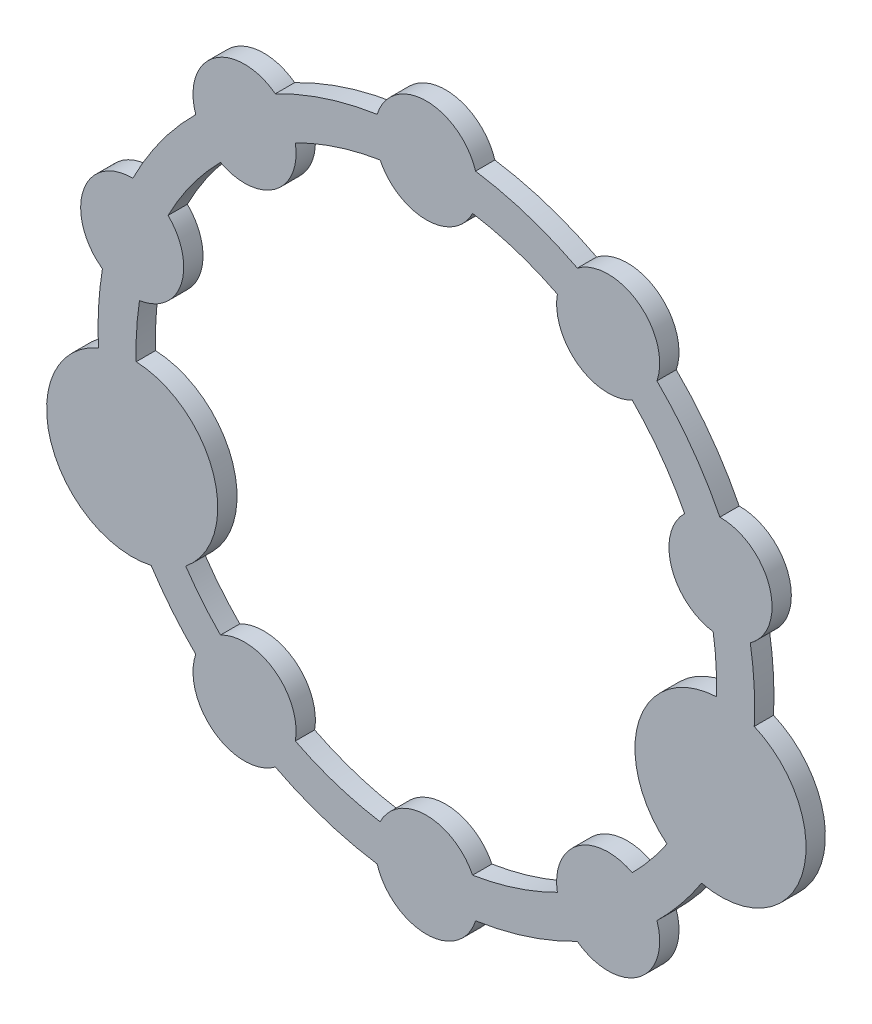
ISO-10303-21;
HEADER;
FILE_DESCRIPTION(('STEP AP214'),'2;1');
FILE_NAME('part.step','',(''),(''),'','','');
FILE_SCHEMA(('AUTOMOTIVE_DESIGN { 1 0 10303 214 1 1 1 1 }'));
ENDSEC;
DATA;
#1=APPLICATION_CONTEXT('core data for automotive mechanical design processes');
#2=APPLICATION_PROTOCOL_DEFINITION('international standard','automotive_design',2000,#1);
#3=PRODUCT_CONTEXT('',#1,'mechanical');
#4=PRODUCT('Part','Part','',(#3));
#5=PRODUCT_RELATED_PRODUCT_CATEGORY('part','',(#4));
#6=PRODUCT_DEFINITION_FORMATION('','',#4);
#7=PRODUCT_DEFINITION_CONTEXT('part definition',#1,'design');
#8=PRODUCT_DEFINITION('design','',#6,#7);
#9=PRODUCT_DEFINITION_SHAPE('','',#8);
#10=(LENGTH_UNIT() NAMED_UNIT(*) SI_UNIT(.MILLI.,.METRE.));
#11=(NAMED_UNIT(*) PLANE_ANGLE_UNIT() SI_UNIT($,.RADIAN.));
#12=(NAMED_UNIT(*) SI_UNIT($,.STERADIAN.) SOLID_ANGLE_UNIT());
#13=UNCERTAINTY_MEASURE_WITH_UNIT(LENGTH_MEASURE(1.E-05),#10,'distance_accuracy_value','');
#14=(GEOMETRIC_REPRESENTATION_CONTEXT(3) GLOBAL_UNCERTAINTY_ASSIGNED_CONTEXT((#13)) GLOBAL_UNIT_ASSIGNED_CONTEXT((#10,
#11,#12)) REPRESENTATION_CONTEXT('',''));
#15=CARTESIAN_POINT('',(0.,0.,0.));
#16=DIRECTION('',(0.,0.,1.));
#17=DIRECTION('',(1.,0.,0.));
#18=AXIS2_PLACEMENT_3D('',#15,#16,#17);
#19=CARTESIAN_POINT('',(0.,0.,0.));
#20=DIRECTION('',(0.,0.,1.));
#21=DIRECTION('',(1.,0.,0.));
#22=AXIS2_PLACEMENT_3D('',#19,#20,#21);
#23=CYLINDRICAL_SURFACE('',#22,34.53);
#24=CARTESIAN_POINT('',(0.,0.,0.));
#25=DIRECTION('',(0.,0.,1.));
#26=DIRECTION('',(1.,0.,0.));
#27=AXIS2_PLACEMENT_3D('',#24,#25,#26);
#28=CIRCLE('',#27,34.53);
#29=CARTESIAN_POINT('',(24.2539232103898,-24.5777970718394,0.));
#30=VERTEX_POINT('',#29);
#31=CARTESIAN_POINT('',(28.94469956259,-18.8288413672059,0.));
#32=VERTEX_POINT('',#31);
#33=EDGE_CURVE('E559',#30,#32,#28,.T.);
#34=ORIENTED_EDGE('',*,*,#33,.T.);
#35=DIRECTION('',(0.,0.,1.));
#36=VECTOR('',#35,1.);
#37=CARTESIAN_POINT('',(28.94469956259,-18.8288413672059,1.015));
#38=LINE('',#37,#36);
#39=CARTESIAN_POINT('',(28.94469956259,-18.8288413672059,2.03));
#40=VERTEX_POINT('',#39);
#41=EDGE_CURVE('E544',#32,#40,#38,.T.);
#42=ORIENTED_EDGE('',*,*,#41,.T.);
#43=CARTESIAN_POINT('',(0.,0.,2.03));
#44=DIRECTION('',(0.,0.,1.));
#45=DIRECTION('',(1.,0.,0.));
#46=AXIS2_PLACEMENT_3D('',#43,#44,#45);
#47=CIRCLE('',#46,34.53);
#48=CARTESIAN_POINT('',(24.2539232103897,-24.5777970718394,2.03));
#49=VERTEX_POINT('',#48);
#50=EDGE_CURVE('E53',#49,#40,#47,.T.);
#51=ORIENTED_EDGE('',*,*,#50,.F.);
#52=DIRECTION('',(0.,0.,-1.));
#53=VECTOR('',#52,1.);
#54=CARTESIAN_POINT('',(24.2539232103898,-24.5777970718394,1.015));
#55=LINE('',#54,#53);
#56=EDGE_CURVE('E511',#49,#30,#55,.T.);
#57=ORIENTED_EDGE('',*,*,#56,.T.);
#58=EDGE_LOOP('',(#34,#42,#51,#57));
#59=FACE_BOUND('',#58,.T.);
#60=ADVANCED_FACE('F38',(#59),#23,.T.);
#61=CARTESIAN_POINT('',(0.,0.,0.));
#62=DIRECTION('',(0.,0.,1.));
#63=DIRECTION('',(1.,0.,0.));
#64=AXIS2_PLACEMENT_3D('',#61,#62,#63);
#65=CYLINDRICAL_SURFACE('',#64,30.53);
#66=DIRECTION('',(0.,0.,1.));
#67=VECTOR('',#66,1.);
#68=CARTESIAN_POINT('',(25.3088081019418,-17.0746927485998,1.015));
#69=LINE('',#68,#67);
#70=CARTESIAN_POINT('',(25.3088081019418,-17.0746927485998,0.));
#71=VERTEX_POINT('',#70);
#72=CARTESIAN_POINT('',(25.3088081019418,-17.0746927485998,2.03));
#73=VERTEX_POINT('',#72);
#74=EDGE_CURVE('E303',#71,#73,#69,.T.);
#75=ORIENTED_EDGE('',*,*,#74,.F.);
#76=CARTESIAN_POINT('',(0.,0.,0.));
#77=DIRECTION('',(0.,0.,1.));
#78=DIRECTION('',(1.,0.,0.));
#79=AXIS2_PLACEMENT_3D('',#76,#77,#78);
#80=CIRCLE('',#79,30.53);
#81=CARTESIAN_POINT('',(21.6513433857745,-21.524410086952,0.));
#82=VERTEX_POINT('',#81);
#83=EDGE_CURVE('E455',#82,#71,#80,.T.);
#84=ORIENTED_EDGE('',*,*,#83,.F.);
#85=DIRECTION('',(0.,0.,-1.));
#86=VECTOR('',#85,1.);
#87=CARTESIAN_POINT('',(21.6513433857745,-21.524410086952,1.015));
#88=LINE('',#87,#86);
#89=CARTESIAN_POINT('',(21.6513433857745,-21.524410086952,2.03));
#90=VERTEX_POINT('',#89);
#91=EDGE_CURVE('E517',#90,#82,#88,.T.);
#92=ORIENTED_EDGE('',*,*,#91,.F.);
#93=CARTESIAN_POINT('',(0.,0.,2.03));
#94=DIRECTION('',(0.,0.,1.));
#95=DIRECTION('',(1.,0.,0.));
#96=AXIS2_PLACEMENT_3D('',#93,#94,#95);
#97=CIRCLE('',#96,30.53);
#98=EDGE_CURVE('E324',#90,#73,#97,.T.);
#99=ORIENTED_EDGE('',*,*,#98,.T.);
#100=EDGE_LOOP('',(#75,#84,#92,#99));
#101=FACE_BOUND('',#100,.T.);
#102=ADVANCED_FACE('F661',(#101),#65,.F.);
#103=CARTESIAN_POINT('',(34.4840691166105,-1.78041488446724,2.03));
#104=VERTEX_POINT('',#103);
#105=CARTESIAN_POINT('',(34.0683027101346,5.62775714211573,2.03));
#106=VERTEX_POINT('',#105);
#107=EDGE_CURVE('E561',#104,#106,#47,.T.);
#108=ORIENTED_EDGE('',*,*,#107,.F.);
#109=DIRECTION('',(0.,0.,1.));
#110=VECTOR('',#109,1.);
#111=CARTESIAN_POINT('',(34.4840691166105,-1.78041488446724,1.015));
#112=LINE('',#111,#110);
#113=CARTESIAN_POINT('',(34.4840691166105,-1.78041488446724,0.));
#114=VERTEX_POINT('',#113);
#115=EDGE_CURVE('E317',#104,#114,#112,.F.);
#116=ORIENTED_EDGE('',*,*,#115,.T.);
#117=CARTESIAN_POINT('',(34.0683027101346,5.62775714211573,0.));
#118=VERTEX_POINT('',#117);
#119=EDGE_CURVE('E622',#114,#118,#28,.T.);
#120=ORIENTED_EDGE('',*,*,#119,.T.);
#121=DIRECTION('',(0.,0.,-1.));
#122=VECTOR('',#121,1.);
#123=CARTESIAN_POINT('',(34.0683027101346,5.62775714211572,1.015));
#124=LINE('',#123,#122);
#125=EDGE_CURVE('E499',#118,#106,#124,.F.);
#126=ORIENTED_EDGE('',*,*,#125,.T.);
#127=EDGE_LOOP('',(#108,#116,#120,#126));
#128=FACE_BOUND('',#127,.T.);
#129=ADVANCED_FACE('F664',(#128),#23,.T.);
#130=DIRECTION('',(0.,0.,1.));
#131=VECTOR('',#130,1.);
#132=CARTESIAN_POINT('',(30.5115084468974,-1.06242754807374,1.015));
#133=LINE('',#132,#131);
#134=CARTESIAN_POINT('',(30.5115084468974,-1.06242754807374,2.03));
#135=VERTEX_POINT('',#134);
#136=CARTESIAN_POINT('',(30.5115084468974,-1.06242754807374,0.));
#137=VERTEX_POINT('',#136);
#138=EDGE_CURVE('E300',#135,#137,#133,.F.);
#139=ORIENTED_EDGE('',*,*,#138,.F.);
#140=CARTESIAN_POINT('',(30.1680355635449,4.68727321976128,2.03));
#141=VERTEX_POINT('',#140);
#142=EDGE_CURVE('E314',#135,#141,#97,.T.);
#143=ORIENTED_EDGE('',*,*,#142,.T.);
#144=DIRECTION('',(0.,0.,-1.));
#145=VECTOR('',#144,1.);
#146=CARTESIAN_POINT('',(30.1680355635449,4.68727321976128,1.015));
#147=LINE('',#146,#145);
#148=CARTESIAN_POINT('',(30.1680355635449,4.68727321976128,0.));
#149=VERTEX_POINT('',#148);
#150=EDGE_CURVE('E505',#149,#141,#147,.F.);
#151=ORIENTED_EDGE('',*,*,#150,.F.);
#152=EDGE_CURVE('E316',#137,#149,#80,.T.);
#153=ORIENTED_EDGE('',*,*,#152,.F.);
#154=EDGE_LOOP('',(#139,#143,#151,#153));
#155=FACE_BOUND('',#154,.T.);
#156=ADVANCED_FACE('F312',(#155),#65,.F.);
#157=CARTESIAN_POINT('',(5.17536940480595,-34.1399538887181,0.));
#158=VERTEX_POINT('',#157);
#159=CARTESIAN_POINT('',(15.8799996090774,-30.6618086944606,0.));
#160=VERTEX_POINT('',#159);
#161=EDGE_CURVE('E623',#158,#160,#28,.T.);
#162=ORIENTED_EDGE('',*,*,#161,.T.);
#163=DIRECTION('',(0.,0.,-1.));
#164=VECTOR('',#163,1.);
#165=CARTESIAN_POINT('',(15.8799996090774,-30.6618086944606,1.015));
#166=LINE('',#165,#164);
#167=CARTESIAN_POINT('',(15.8799996090774,-30.6618086944606,2.03));
#168=VERTEX_POINT('',#167);
#169=EDGE_CURVE('E61',#160,#168,#166,.F.);
#170=ORIENTED_EDGE('',*,*,#169,.T.);
#171=CARTESIAN_POINT('',(5.17536940480595,-34.1399538887181,2.03));
#172=VERTEX_POINT('',#171);
#173=EDGE_CURVE('E461',#172,#168,#47,.T.);
#174=ORIENTED_EDGE('',*,*,#173,.F.);
#175=DIRECTION('',(0.,0.,1.));
#176=VECTOR('',#175,1.);
#177=CARTESIAN_POINT('',(5.17536940480595,-34.1399538887181,1.015));
#178=LINE('',#177,#176);
#179=EDGE_CURVE('E638',#158,#172,#178,.T.);
#180=ORIENTED_EDGE('',*,*,#179,.F.);
#181=EDGE_LOOP('',(#162,#170,#174,#180));
#182=FACE_BOUND('',#181,.T.);
#183=ADVANCED_FACE('F672',(#182),#23,.T.);
#184=DIRECTION('',(0.,0.,-1.));
#185=VECTOR('',#184,1.);
#186=CARTESIAN_POINT('',(13.7802974153529,-27.2430597243485,1.015));
#187=LINE('',#186,#185);
#188=CARTESIAN_POINT('',(13.7802974153529,-27.2430597243485,0.));
#189=VERTEX_POINT('',#188);
#190=CARTESIAN_POINT('',(13.7802974153529,-27.2430597243485,2.03));
#191=VERTEX_POINT('',#190);
#192=EDGE_CURVE('E520',#189,#191,#187,.F.);
#193=ORIENTED_EDGE('',*,*,#192,.F.);
#194=CARTESIAN_POINT('',(4.86457393673344,-30.1399538887181,0.));
#195=VERTEX_POINT('',#194);
#196=EDGE_CURVE('E341',#195,#189,#80,.T.);
#197=ORIENTED_EDGE('',*,*,#196,.F.);
#198=DIRECTION('',(0.,0.,1.));
#199=VECTOR('',#198,1.);
#200=CARTESIAN_POINT('',(4.86457393673344,-30.1399538887181,1.015));
#201=LINE('',#200,#199);
#202=CARTESIAN_POINT('',(4.86457393673344,-30.1399538887181,2.03));
#203=VERTEX_POINT('',#202);
#204=EDGE_CURVE('E631',#195,#203,#201,.T.);
#205=ORIENTED_EDGE('',*,*,#204,.T.);
#206=EDGE_CURVE('E328',#203,#191,#97,.T.);
#207=ORIENTED_EDGE('',*,*,#206,.T.);
#208=EDGE_LOOP('',(#193,#197,#205,#207));
#209=FACE_BOUND('',#208,.T.);
#210=ADVANCED_FACE('F656',(#209),#65,.F.);
#211=CARTESIAN_POINT('',(30.8697485136282,15.4718947354662,2.03));
#212=VERTEX_POINT('',#211);
#213=CARTESIAN_POINT('',(24.2539232103897,24.5777970718394,2.03));
#214=VERTEX_POINT('',#213);
#215=EDGE_CURVE('E562',#212,#214,#47,.T.);
#216=ORIENTED_EDGE('',*,*,#215,.F.);
#217=DIRECTION('',(0.,0.,-1.));
#218=VECTOR('',#217,1.);
#219=CARTESIAN_POINT('',(30.8697485136282,15.4718947354662,1.015));
#220=LINE('',#219,#218);
#221=CARTESIAN_POINT('',(30.8697485136282,15.4718947354662,0.));
#222=VERTEX_POINT('',#221);
#223=EDGE_CURVE('E494',#212,#222,#220,.T.);
#224=ORIENTED_EDGE('',*,*,#223,.T.);
#225=CARTESIAN_POINT('',(24.2539232103897,24.5777970718394,0.));
#226=VERTEX_POINT('',#225);
#227=EDGE_CURVE('E624',#222,#226,#28,.T.);
#228=ORIENTED_EDGE('',*,*,#227,.T.);
#229=DIRECTION('',(0.,0.,-1.));
#230=VECTOR('',#229,1.);
#231=CARTESIAN_POINT('',(24.2539232103897,24.5777970718394,1.015));
#232=LINE('',#231,#230);
#233=EDGE_CURVE('E487',#226,#214,#232,.F.);
#234=ORIENTED_EDGE('',*,*,#233,.T.);
#235=EDGE_LOOP('',(#216,#224,#228,#234));
#236=FACE_BOUND('',#235,.T.);
#237=ADVANCED_FACE('F708',(#236),#23,.T.);
#238=DIRECTION('',(0.,0.,-1.));
#239=VECTOR('',#238,1.);
#240=CARTESIAN_POINT('',(27.1615635298567,13.9402427028211,1.015));
#241=LINE('',#240,#239);
#242=CARTESIAN_POINT('',(27.1615635298567,13.9402427028211,2.03));
#243=VERTEX_POINT('',#242);
#244=CARTESIAN_POINT('',(27.1615635298567,13.9402427028211,0.));
#245=VERTEX_POINT('',#244);
#246=EDGE_CURVE('E502',#243,#245,#241,.T.);
#247=ORIENTED_EDGE('',*,*,#246,.F.);
#248=CARTESIAN_POINT('',(21.6513433857745,21.524410086952,2.03));
#249=VERTEX_POINT('',#248);
#250=EDGE_CURVE('E325',#243,#249,#97,.T.);
#251=ORIENTED_EDGE('',*,*,#250,.T.);
#252=DIRECTION('',(0.,0.,-1.));
#253=VECTOR('',#252,1.);
#254=CARTESIAN_POINT('',(21.6513433857745,21.524410086952,1.015));
#255=LINE('',#254,#253);
#256=CARTESIAN_POINT('',(21.6513433857745,21.524410086952,0.));
#257=VERTEX_POINT('',#256);
#258=EDGE_CURVE('E488',#257,#249,#255,.F.);
#259=ORIENTED_EDGE('',*,*,#258,.F.);
#260=EDGE_CURVE('E464',#245,#257,#80,.T.);
#261=ORIENTED_EDGE('',*,*,#260,.F.);
#262=EDGE_LOOP('',(#247,#251,#259,#261));
#263=FACE_BOUND('',#262,.T.);
#264=ADVANCED_FACE('F704',(#263),#65,.F.);
#265=CARTESIAN_POINT('',(15.8799996090774,30.6618086944606,2.03));
#266=VERTEX_POINT('',#265);
#267=CARTESIAN_POINT('',(5.17536940480592,34.1399538887181,2.03));
#268=VERTEX_POINT('',#267);
#269=EDGE_CURVE('E565',#266,#268,#47,.T.);
#270=ORIENTED_EDGE('',*,*,#269,.F.);
#271=DIRECTION('',(0.,0.,-1.));
#272=VECTOR('',#271,1.);
#273=CARTESIAN_POINT('',(15.8799996090774,30.6618086944606,1.015));
#274=LINE('',#273,#272);
#275=CARTESIAN_POINT('',(15.8799996090774,30.6618086944606,0.));
#276=VERTEX_POINT('',#275);
#277=EDGE_CURVE('E397',#266,#276,#274,.T.);
#278=ORIENTED_EDGE('',*,*,#277,.T.);
#279=CARTESIAN_POINT('',(5.17536940480592,34.1399538887181,0.));
#280=VERTEX_POINT('',#279);
#281=EDGE_CURVE('E581',#276,#280,#28,.T.);
#282=ORIENTED_EDGE('',*,*,#281,.T.);
#283=DIRECTION('',(0.,0.,-1.));
#284=VECTOR('',#283,1.);
#285=CARTESIAN_POINT('',(5.17536940480594,34.1399538887181,1.015));
#286=LINE('',#285,#284);
#287=EDGE_CURVE('E401',#280,#268,#286,.F.);
#288=ORIENTED_EDGE('',*,*,#287,.T.);
#289=EDGE_LOOP('',(#270,#278,#282,#288));
#290=FACE_BOUND('',#289,.T.);
#291=ADVANCED_FACE('F580',(#290),#23,.T.);
#292=DIRECTION('',(0.,0.,-1.));
#293=VECTOR('',#292,1.);
#294=CARTESIAN_POINT('',(13.7802974153529,27.2430597243485,1.015));
#295=LINE('',#294,#293);
#296=CARTESIAN_POINT('',(13.7802974153529,27.2430597243485,2.03));
#297=VERTEX_POINT('',#296);
#298=CARTESIAN_POINT('',(13.7802974153529,27.2430597243485,0.));
#299=VERTEX_POINT('',#298);
#300=EDGE_CURVE('E378',#297,#299,#295,.T.);
#301=ORIENTED_EDGE('',*,*,#300,.F.);
#302=CARTESIAN_POINT('',(4.86457393673343,30.1399538887181,2.03));
#303=VERTEX_POINT('',#302);
#304=EDGE_CURVE('E329',#297,#303,#97,.T.);
#305=ORIENTED_EDGE('',*,*,#304,.T.);
#306=DIRECTION('',(0.,0.,-1.));
#307=VECTOR('',#306,1.);
#308=CARTESIAN_POINT('',(4.86457393673343,30.1399538887181,1.015));
#309=LINE('',#308,#307);
#310=CARTESIAN_POINT('',(4.86457393673343,30.1399538887181,0.));
#311=VERTEX_POINT('',#310);
#312=EDGE_CURVE('E376',#311,#303,#309,.F.);
#313=ORIENTED_EDGE('',*,*,#312,.F.);
#314=EDGE_CURVE('E466',#299,#311,#80,.T.);
#315=ORIENTED_EDGE('',*,*,#314,.F.);
#316=EDGE_LOOP('',(#301,#305,#313,#315));
#317=FACE_BOUND('',#316,.T.);
#318=ADVANCED_FACE('F374',(#317),#65,.F.);
#319=CARTESIAN_POINT('',(-5.17536940480593,34.1399538887181,2.03));
#320=VERTEX_POINT('',#319);
#321=CARTESIAN_POINT('',(-15.8799996090774,30.6618086944606,2.03));
#322=VERTEX_POINT('',#321);
#323=EDGE_CURVE('E572',#320,#322,#47,.T.);
#324=ORIENTED_EDGE('',*,*,#323,.F.);
#325=DIRECTION('',(0.,0.,-1.));
#326=VECTOR('',#325,1.);
#327=CARTESIAN_POINT('',(-5.17536940480595,34.1399538887181,1.015));
#328=LINE('',#327,#326);
#329=CARTESIAN_POINT('',(-5.17536940480595,34.1399538887181,0.));
#330=VERTEX_POINT('',#329);
#331=EDGE_CURVE('E404',#320,#330,#328,.T.);
#332=ORIENTED_EDGE('',*,*,#331,.T.);
#333=CARTESIAN_POINT('',(-15.8799996090774,30.6618086944606,0.));
#334=VERTEX_POINT('',#333);
#335=EDGE_CURVE('E588',#330,#334,#28,.T.);
#336=ORIENTED_EDGE('',*,*,#335,.T.);
#337=DIRECTION('',(0.,0.,-1.));
#338=VECTOR('',#337,1.);
#339=CARTESIAN_POINT('',(-15.8799996090774,30.6618086944606,1.015));
#340=LINE('',#339,#338);
#341=EDGE_CURVE('E419',#334,#322,#340,.F.);
#342=ORIENTED_EDGE('',*,*,#341,.T.);
#343=EDGE_LOOP('',(#324,#332,#336,#342));
#344=FACE_BOUND('',#343,.T.);
#345=ADVANCED_FACE('F587',(#344),#23,.T.);
#346=DIRECTION('',(0.,0.,-1.));
#347=VECTOR('',#346,1.);
#348=CARTESIAN_POINT('',(-4.86457393673344,30.1399538887181,1.015));
#349=LINE('',#348,#347);
#350=CARTESIAN_POINT('',(-4.86457393673344,30.1399538887181,2.03));
#351=VERTEX_POINT('',#350);
#352=CARTESIAN_POINT('',(-4.86457393673342,30.1399538887181,0.));
#353=VERTEX_POINT('',#352);
#354=EDGE_CURVE('E387',#351,#353,#349,.T.);
#355=ORIENTED_EDGE('',*,*,#354,.F.);
#356=CARTESIAN_POINT('',(-13.7802974153529,27.2430597243485,2.03));
#357=VERTEX_POINT('',#356);
#358=EDGE_CURVE('E358',#351,#357,#97,.T.);
#359=ORIENTED_EDGE('',*,*,#358,.T.);
#360=DIRECTION('',(0.,0.,-1.));
#361=VECTOR('',#360,1.);
#362=CARTESIAN_POINT('',(-13.7802974153529,27.2430597243485,1.015));
#363=LINE('',#362,#361);
#364=CARTESIAN_POINT('',(-13.7802974153529,27.2430597243485,0.));
#365=VERTEX_POINT('',#364);
#366=EDGE_CURVE('E414',#365,#357,#363,.F.);
#367=ORIENTED_EDGE('',*,*,#366,.F.);
#368=EDGE_CURVE('E472',#353,#365,#80,.T.);
#369=ORIENTED_EDGE('',*,*,#368,.F.);
#370=EDGE_LOOP('',(#355,#359,#367,#369));
#371=FACE_BOUND('',#370,.T.);
#372=ADVANCED_FACE('F695',(#371),#65,.F.);
#373=CARTESIAN_POINT('',(-24.2539232103897,24.5777970718394,2.03));
#374=VERTEX_POINT('',#373);
#375=CARTESIAN_POINT('',(-30.8697485136282,15.4718947354662,2.03));
#376=VERTEX_POINT('',#375);
#377=EDGE_CURVE('E570',#374,#376,#47,.T.);
#378=ORIENTED_EDGE('',*,*,#377,.F.);
#379=DIRECTION('',(0.,0.,-1.));
#380=VECTOR('',#379,1.);
#381=CARTESIAN_POINT('',(-24.2539232103898,24.5777970718394,1.015));
#382=LINE('',#381,#380);
#383=CARTESIAN_POINT('',(-24.2539232103898,24.5777970718394,0.));
#384=VERTEX_POINT('',#383);
#385=EDGE_CURVE('E422',#374,#384,#382,.T.);
#386=ORIENTED_EDGE('',*,*,#385,.T.);
#387=CARTESIAN_POINT('',(-30.8697485136282,15.4718947354662,0.));
#388=VERTEX_POINT('',#387);
#389=EDGE_CURVE('E598',#384,#388,#28,.T.);
#390=ORIENTED_EDGE('',*,*,#389,.T.);
#391=DIRECTION('',(0.,0.,-1.));
#392=VECTOR('',#391,1.);
#393=CARTESIAN_POINT('',(-30.8697485136282,15.4718947354662,1.015));
#394=LINE('',#393,#392);
#395=EDGE_CURVE('E438',#388,#376,#394,.F.);
#396=ORIENTED_EDGE('',*,*,#395,.T.);
#397=EDGE_LOOP('',(#378,#386,#390,#396));
#398=FACE_BOUND('',#397,.T.);
#399=ADVANCED_FACE('F597',(#398),#23,.T.);
#400=DIRECTION('',(0.,0.,-1.));
#401=VECTOR('',#400,1.);
#402=CARTESIAN_POINT('',(-21.6513433857745,21.524410086952,1.015));
#403=LINE('',#402,#401);
#404=CARTESIAN_POINT('',(-21.6513433857745,21.524410086952,2.03));
#405=VERTEX_POINT('',#404);
#406=CARTESIAN_POINT('',(-21.6513433857745,21.524410086952,0.));
#407=VERTEX_POINT('',#406);
#408=EDGE_CURVE('E416',#405,#407,#403,.T.);
#409=ORIENTED_EDGE('',*,*,#408,.F.);
#410=CARTESIAN_POINT('',(-27.1615635298567,13.9402427028211,2.03));
#411=VERTEX_POINT('',#410);
#412=EDGE_CURVE('E353',#405,#411,#97,.T.);
#413=ORIENTED_EDGE('',*,*,#412,.T.);
#414=DIRECTION('',(0.,0.,-1.));
#415=VECTOR('',#414,1.);
#416=CARTESIAN_POINT('',(-27.1615635298567,13.9402427028211,1.015));
#417=LINE('',#416,#415);
#418=CARTESIAN_POINT('',(-27.1615635298567,13.9402427028211,0.));
#419=VERTEX_POINT('',#418);
#420=EDGE_CURVE('E433',#419,#411,#417,.F.);
#421=ORIENTED_EDGE('',*,*,#420,.F.);
#422=EDGE_CURVE('E470',#407,#419,#80,.T.);
#423=ORIENTED_EDGE('',*,*,#422,.F.);
#424=EDGE_LOOP('',(#409,#413,#421,#423));
#425=FACE_BOUND('',#424,.T.);
#426=ADVANCED_FACE('F690',(#425),#65,.F.);
#427=DIRECTION('',(0.,0.,1.));
#428=VECTOR('',#427,1.);
#429=CARTESIAN_POINT('',(-34.4840691166105,-1.78041488446724,1.015));
#430=LINE('',#429,#428);
#431=CARTESIAN_POINT('',(-34.4840691166105,-1.78041488446724,2.03));
#432=VERTEX_POINT('',#431);
#433=CARTESIAN_POINT('',(-34.4840691166105,-1.78041488446724,0.));
#434=VERTEX_POINT('',#433);
#435=EDGE_CURVE('E527',#432,#434,#430,.F.);
#436=ORIENTED_EDGE('',*,*,#435,.F.);
#437=CARTESIAN_POINT('',(-34.0683027101346,5.62775714211572,2.03));
#438=VERTEX_POINT('',#437);
#439=EDGE_CURVE('E462',#438,#432,#47,.T.);
#440=ORIENTED_EDGE('',*,*,#439,.F.);
#441=DIRECTION('',(0.,0.,-1.));
#442=VECTOR('',#441,1.);
#443=CARTESIAN_POINT('',(-34.0683027101346,5.62775714211571,1.015));
#444=LINE('',#443,#442);
#445=CARTESIAN_POINT('',(-34.0683027101346,5.62775714211571,0.));
#446=VERTEX_POINT('',#445);
#447=EDGE_CURVE('E441',#438,#446,#444,.T.);
#448=ORIENTED_EDGE('',*,*,#447,.T.);
#449=EDGE_CURVE('E610',#446,#434,#28,.T.);
#450=ORIENTED_EDGE('',*,*,#449,.T.);
#451=EDGE_LOOP('',(#436,#440,#448,#450));
#452=FACE_BOUND('',#451,.T.);
#453=ADVANCED_FACE('F609',(#452),#23,.T.);
#454=CARTESIAN_POINT('',(-30.1680355635449,4.68727321976127,2.03));
#455=VERTEX_POINT('',#454);
#456=CARTESIAN_POINT('',(-30.5115084468974,-1.06242754807374,2.03));
#457=VERTEX_POINT('',#456);
#458=EDGE_CURVE('E332',#455,#457,#97,.T.);
#459=ORIENTED_EDGE('',*,*,#458,.T.);
#460=DIRECTION('',(0.,0.,1.));
#461=VECTOR('',#460,1.);
#462=CARTESIAN_POINT('',(-30.5115084468974,-1.06242754807374,1.015));
#463=LINE('',#462,#461);
#464=CARTESIAN_POINT('',(-30.5115084468974,-1.06242754807374,0.));
#465=VERTEX_POINT('',#464);
#466=EDGE_CURVE('E532',#457,#465,#463,.F.);
#467=ORIENTED_EDGE('',*,*,#466,.T.);
#468=CARTESIAN_POINT('',(-30.1680355635449,4.68727321976129,0.));
#469=VERTEX_POINT('',#468);
#470=EDGE_CURVE('E342',#469,#465,#80,.T.);
#471=ORIENTED_EDGE('',*,*,#470,.F.);
#472=DIRECTION('',(0.,0.,-1.));
#473=VECTOR('',#472,1.);
#474=CARTESIAN_POINT('',(-30.1680355635449,4.68727321976127,1.015));
#475=LINE('',#474,#473);
#476=EDGE_CURVE('E435',#455,#469,#475,.T.);
#477=ORIENTED_EDGE('',*,*,#476,.F.);
#478=EDGE_LOOP('',(#459,#467,#471,#477));
#479=FACE_BOUND('',#478,.T.);
#480=ADVANCED_FACE('F685',(#479),#65,.F.);
#481=DIRECTION('',(0.,0.,1.));
#482=VECTOR('',#481,1.);
#483=CARTESIAN_POINT('',(-28.94469956259,-18.8288413672059,1.015));
#484=LINE('',#483,#482);
#485=CARTESIAN_POINT('',(-28.94469956259,-18.8288413672059,0.));
#486=VERTEX_POINT('',#485);
#487=CARTESIAN_POINT('',(-28.94469956259,-18.8288413672059,2.03));
#488=VERTEX_POINT('',#487);
#489=EDGE_CURVE('E534',#486,#488,#484,.T.);
#490=ORIENTED_EDGE('',*,*,#489,.F.);
#491=CARTESIAN_POINT('',(-24.2539232103897,-24.5777970718394,0.));
#492=VERTEX_POINT('',#491);
#493=EDGE_CURVE('E618',#486,#492,#28,.T.);
#494=ORIENTED_EDGE('',*,*,#493,.T.);
#495=DIRECTION('',(0.,0.,-1.));
#496=VECTOR('',#495,1.);
#497=CARTESIAN_POINT('',(-24.2539232103897,-24.5777970718394,1.015));
#498=LINE('',#497,#496);
#499=CARTESIAN_POINT('',(-24.2539232103897,-24.5777970718394,2.03));
#500=VERTEX_POINT('',#499);
#501=EDGE_CURVE('E350',#492,#500,#498,.F.);
#502=ORIENTED_EDGE('',*,*,#501,.T.);
#503=EDGE_CURVE('E459',#488,#500,#47,.T.);
#504=ORIENTED_EDGE('',*,*,#503,.F.);
#505=EDGE_LOOP('',(#490,#494,#502,#504));
#506=FACE_BOUND('',#505,.T.);
#507=ADVANCED_FACE('F683',(#506),#23,.T.);
#508=CARTESIAN_POINT('',(-25.3088081019418,-17.0746927485998,0.));
#509=VERTEX_POINT('',#508);
#510=CARTESIAN_POINT('',(-21.6513433857745,-21.524410086952,0.));
#511=VERTEX_POINT('',#510);
#512=EDGE_CURVE('E340',#509,#511,#80,.T.);
#513=ORIENTED_EDGE('',*,*,#512,.F.);
#514=DIRECTION('',(0.,0.,1.));
#515=VECTOR('',#514,1.);
#516=CARTESIAN_POINT('',(-25.3088081019418,-17.0746927485998,1.015));
#517=LINE('',#516,#515);
#518=CARTESIAN_POINT('',(-25.3088081019418,-17.0746927485998,2.03));
#519=VERTEX_POINT('',#518);
#520=EDGE_CURVE('E536',#509,#519,#517,.T.);
#521=ORIENTED_EDGE('',*,*,#520,.T.);
#522=CARTESIAN_POINT('',(-21.6513433857745,-21.524410086952,2.03));
#523=VERTEX_POINT('',#522);
#524=EDGE_CURVE('E327',#519,#523,#97,.T.);
#525=ORIENTED_EDGE('',*,*,#524,.T.);
#526=DIRECTION('',(0.,0.,-1.));
#527=VECTOR('',#526,1.);
#528=CARTESIAN_POINT('',(-21.6513433857745,-21.524410086952,1.015));
#529=LINE('',#528,#527);
#530=EDGE_CURVE('E46',#511,#523,#529,.F.);
#531=ORIENTED_EDGE('',*,*,#530,.F.);
#532=EDGE_LOOP('',(#513,#521,#525,#531));
#533=FACE_BOUND('',#532,.T.);
#534=ADVANCED_FACE('F677',(#533),#65,.F.);
#535=CARTESIAN_POINT('',(-15.8799996090774,-30.6618086944606,2.03));
#536=VERTEX_POINT('',#535);
#537=CARTESIAN_POINT('',(-5.17536940480595,-34.1399538887181,2.03));
#538=VERTEX_POINT('',#537);
#539=EDGE_CURVE('E454',#536,#538,#47,.T.);
#540=ORIENTED_EDGE('',*,*,#539,.F.);
#541=DIRECTION('',(0.,0.,-1.));
#542=VECTOR('',#541,1.);
#543=CARTESIAN_POINT('',(-15.8799996090774,-30.6618086944606,1.015));
#544=LINE('',#543,#542);
#545=CARTESIAN_POINT('',(-15.8799996090774,-30.6618086944606,0.));
#546=VERTEX_POINT('',#545);
#547=EDGE_CURVE('E343',#536,#546,#544,.T.);
#548=ORIENTED_EDGE('',*,*,#547,.T.);
#549=CARTESIAN_POINT('',(-5.17536940480595,-34.1399538887181,0.));
#550=VERTEX_POINT('',#549);
#551=EDGE_CURVE('E563',#546,#550,#28,.T.);
#552=ORIENTED_EDGE('',*,*,#551,.T.);
#553=DIRECTION('',(0.,0.,1.));
#554=VECTOR('',#553,1.);
#555=CARTESIAN_POINT('',(-5.17536940480595,-34.1399538887181,1.015));
#556=LINE('',#555,#554);
#557=EDGE_CURVE('E633',#538,#550,#556,.F.);
#558=ORIENTED_EDGE('',*,*,#557,.F.);
#559=EDGE_LOOP('',(#540,#548,#552,#558));
#560=FACE_BOUND('',#559,.T.);
#561=ADVANCED_FACE('F673',(#560),#23,.T.);
#562=DIRECTION('',(0.,0.,-1.));
#563=VECTOR('',#562,1.);
#564=CARTESIAN_POINT('',(-13.7802974153529,-27.2430597243485,1.015));
#565=LINE('',#564,#563);
#566=CARTESIAN_POINT('',(-13.7802974153529,-27.2430597243485,2.03));
#567=VERTEX_POINT('',#566);
#568=CARTESIAN_POINT('',(-13.7802974153529,-27.2430597243485,0.));
#569=VERTEX_POINT('',#568);
#570=EDGE_CURVE('E11',#567,#569,#565,.T.);
#571=ORIENTED_EDGE('',*,*,#570,.F.);
#572=CARTESIAN_POINT('',(-4.86457393673344,-30.1399538887181,2.03));
#573=VERTEX_POINT('',#572);
#574=EDGE_CURVE('E333',#567,#573,#97,.T.);
#575=ORIENTED_EDGE('',*,*,#574,.T.);
#576=DIRECTION('',(0.,0.,1.));
#577=VECTOR('',#576,1.);
#578=CARTESIAN_POINT('',(-4.86457393673344,-30.1399538887181,1.015));
#579=LINE('',#578,#577);
#580=CARTESIAN_POINT('',(-4.86457393673344,-30.1399538887181,0.));
#581=VERTEX_POINT('',#580);
#582=EDGE_CURVE('E628',#573,#581,#579,.F.);
#583=ORIENTED_EDGE('',*,*,#582,.T.);
#584=EDGE_CURVE('E335',#569,#581,#80,.T.);
#585=ORIENTED_EDGE('',*,*,#584,.F.);
#586=EDGE_LOOP('',(#571,#575,#583,#585));
#587=FACE_BOUND('',#586,.T.);
#588=ADVANCED_FACE('F666',(#587),#65,.F.);
#589=CARTESIAN_POINT('',(0.,-32.53,2.03));
#590=DIRECTION('',(0.,0.,-1.));
#591=DIRECTION('',(-1.,0.,0.));
#592=AXIS2_PLACEMENT_3D('',#589,#590,#591);
#593=CYLINDRICAL_SURFACE('',#592,5.42);
#594=ORIENTED_EDGE('',*,*,#204,.F.);
#595=CARTESIAN_POINT('',(0.,-32.53,0.));
#596=DIRECTION('',(0.,0.,1.));
#597=DIRECTION('',(1.,0.,0.));
#598=AXIS2_PLACEMENT_3D('',#595,#596,#597);
#599=CIRCLE('',#598,5.42);
#600=EDGE_CURVE('E645',#195,#581,#599,.T.);
#601=ORIENTED_EDGE('',*,*,#600,.T.);
#602=ORIENTED_EDGE('',*,*,#582,.F.);
#603=CARTESIAN_POINT('',(0.,-32.53,2.03));
#604=DIRECTION('',(0.,0.,1.));
#605=DIRECTION('',(1.,0.,0.));
#606=AXIS2_PLACEMENT_3D('',#603,#604,#605);
#607=CIRCLE('',#606,5.42);
#608=EDGE_CURVE('E641',#203,#573,#607,.T.);
#609=ORIENTED_EDGE('',*,*,#608,.F.);
#610=EDGE_LOOP('',(#594,#601,#602,#609));
#611=FACE_BOUND('',#610,.T.);
#612=ADVANCED_FACE('F655',(#611),#593,.T.);
#613=EDGE_CURVE('E640',#550,#158,#599,.T.);
#614=ORIENTED_EDGE('',*,*,#613,.T.);
#615=ORIENTED_EDGE('',*,*,#179,.T.);
#616=EDGE_CURVE('E644',#538,#172,#607,.T.);
#617=ORIENTED_EDGE('',*,*,#616,.F.);
#618=ORIENTED_EDGE('',*,*,#557,.T.);
#619=EDGE_LOOP('',(#614,#615,#617,#618));
#620=FACE_BOUND('',#619,.T.);
#621=ADVANCED_FACE('F40',(#620),#593,.T.);
#622=CARTESIAN_POINT('',(0.,-32.53,2.03));
#623=DIRECTION('',(0.,0.,1.));
#624=DIRECTION('',(1.,0.,0.));
#625=AXIS2_PLACEMENT_3D('',#622,#623,#624);
#626=PLANE('',#625);
#627=ORIENTED_EDGE('',*,*,#50,.T.);
#628=CARTESIAN_POINT('',(30.9378684750813,-10.052322827017,2.03));
#629=DIRECTION('',(0.,0.,-1.));
#630=DIRECTION('',(-1.,0.,0.));
#631=AXIS2_PLACEMENT_3D('',#628,#629,#630);
#632=CIRCLE('',#631,9.);
#633=EDGE_CURVE('E308',#104,#40,#632,.T.);
#634=ORIENTED_EDGE('',*,*,#633,.F.);
#635=ORIENTED_EDGE('',*,*,#107,.T.);
#636=CARTESIAN_POINT('',(30.9378684750813,10.052322827017,2.03));
#637=DIRECTION('',(0.,0.,1.));
#638=DIRECTION('',(1.,0.,0.));
#639=AXIS2_PLACEMENT_3D('',#636,#637,#638);
#640=CIRCLE('',#639,5.42);
#641=EDGE_CURVE('E512',#106,#212,#640,.T.);
#642=ORIENTED_EDGE('',*,*,#641,.T.);
#643=ORIENTED_EDGE('',*,*,#215,.T.);
#644=CARTESIAN_POINT('',(19.1206542570742,26.317322827017,2.03));
#645=DIRECTION('',(0.,0.,1.));
#646=DIRECTION('',(1.,0.,0.));
#647=AXIS2_PLACEMENT_3D('',#644,#645,#646);
#648=CIRCLE('',#647,5.42);
#649=EDGE_CURVE('E482',#214,#266,#648,.T.);
#650=ORIENTED_EDGE('',*,*,#649,.T.);
#651=ORIENTED_EDGE('',*,*,#269,.T.);
#652=CARTESIAN_POINT('',(0.,32.53,2.03));
#653=DIRECTION('',(0.,0.,1.));
#654=DIRECTION('',(1.,0.,0.));
#655=AXIS2_PLACEMENT_3D('',#652,#653,#654);
#656=CIRCLE('',#655,5.42);
#657=EDGE_CURVE('E388',#268,#320,#656,.T.);
#658=ORIENTED_EDGE('',*,*,#657,.T.);
#659=ORIENTED_EDGE('',*,*,#323,.T.);
#660=CARTESIAN_POINT('',(-19.1206542570742,26.317322827017,2.03));
#661=DIRECTION('',(0.,0.,1.));
#662=DIRECTION('',(1.,0.,0.));
#663=AXIS2_PLACEMENT_3D('',#660,#661,#662);
#664=CIRCLE('',#663,5.42);
#665=EDGE_CURVE('E410',#322,#374,#664,.T.);
#666=ORIENTED_EDGE('',*,*,#665,.T.);
#667=ORIENTED_EDGE('',*,*,#377,.T.);
#668=CARTESIAN_POINT('',(-30.9378684750813,10.052322827017,2.03));
#669=DIRECTION('',(0.,0.,1.));
#670=DIRECTION('',(1.,0.,0.));
#671=AXIS2_PLACEMENT_3D('',#668,#669,#670);
#672=CIRCLE('',#671,5.42);
#673=EDGE_CURVE('E429',#376,#438,#672,.T.);
#674=ORIENTED_EDGE('',*,*,#673,.T.);
#675=ORIENTED_EDGE('',*,*,#439,.T.);
#676=CARTESIAN_POINT('',(-30.9378684750813,-10.052322827017,2.03));
#677=DIRECTION('',(0.,0.,1.));
#678=DIRECTION('',(1.,0.,0.));
#679=AXIS2_PLACEMENT_3D('',#676,#677,#678);
#680=CIRCLE('',#679,9.);
#681=EDGE_CURVE('E543',#432,#488,#680,.T.);
#682=ORIENTED_EDGE('',*,*,#681,.T.);
#683=ORIENTED_EDGE('',*,*,#503,.T.);
#684=CARTESIAN_POINT('',(-19.1206542570742,-26.317322827017,2.03));
#685=DIRECTION('',(0.,0.,1.));
#686=DIRECTION('',(1.,0.,0.));
#687=AXIS2_PLACEMENT_3D('',#684,#685,#686);
#688=CIRCLE('',#687,5.42);
#689=EDGE_CURVE('E448',#500,#536,#688,.T.);
#690=ORIENTED_EDGE('',*,*,#689,.T.);
#691=ORIENTED_EDGE('',*,*,#539,.T.);
#692=ORIENTED_EDGE('',*,*,#616,.T.);
#693=ORIENTED_EDGE('',*,*,#173,.T.);
#694=CARTESIAN_POINT('',(19.1206542570742,-26.317322827017,2.03));
#695=DIRECTION('',(0.,0.,1.));
#696=DIRECTION('',(1.,0.,0.));
#697=AXIS2_PLACEMENT_3D('',#694,#695,#696);
#698=CIRCLE('',#697,5.42);
#699=EDGE_CURVE('E528',#168,#49,#698,.T.);
#700=ORIENTED_EDGE('',*,*,#699,.T.);
#701=EDGE_LOOP('',(#627,#634,#635,#642,#643,#650,#651,#658,#659,#666,#667,#674,#675,#682,#683,
#690,#691,#692,#693,#700));
#702=FACE_BOUND('',#701,.T.);
#703=EDGE_CURVE('E297',#73,#135,#632,.T.);
#704=ORIENTED_EDGE('',*,*,#703,.F.);
#705=ORIENTED_EDGE('',*,*,#98,.F.);
#706=EDGE_CURVE('E522',#90,#191,#698,.T.);
#707=ORIENTED_EDGE('',*,*,#706,.T.);
#708=ORIENTED_EDGE('',*,*,#206,.F.);
#709=ORIENTED_EDGE('',*,*,#608,.T.);
#710=ORIENTED_EDGE('',*,*,#574,.F.);
#711=EDGE_CURVE('E445',#567,#523,#688,.T.);
#712=ORIENTED_EDGE('',*,*,#711,.T.);
#713=ORIENTED_EDGE('',*,*,#524,.F.);
#714=EDGE_CURVE('E540',#519,#457,#680,.T.);
#715=ORIENTED_EDGE('',*,*,#714,.T.);
#716=ORIENTED_EDGE('',*,*,#458,.F.);
#717=EDGE_CURVE('E426',#455,#411,#672,.T.);
#718=ORIENTED_EDGE('',*,*,#717,.T.);
#719=ORIENTED_EDGE('',*,*,#412,.F.);
#720=EDGE_CURVE('E408',#405,#357,#664,.T.);
#721=ORIENTED_EDGE('',*,*,#720,.T.);
#722=ORIENTED_EDGE('',*,*,#358,.F.);
#723=EDGE_CURVE('E385',#351,#303,#656,.T.);
#724=ORIENTED_EDGE('',*,*,#723,.T.);
#725=ORIENTED_EDGE('',*,*,#304,.F.);
#726=EDGE_CURVE('E486',#297,#249,#648,.T.);
#727=ORIENTED_EDGE('',*,*,#726,.T.);
#728=ORIENTED_EDGE('',*,*,#250,.F.);
#729=EDGE_CURVE('E323',#243,#141,#640,.T.);
#730=ORIENTED_EDGE('',*,*,#729,.T.);
#731=ORIENTED_EDGE('',*,*,#142,.F.);
#732=EDGE_LOOP('',(#704,#705,#707,#708,#709,#710,#712,#713,#715,#716,#718,#719,#721,#722,#724,
#725,#727,#728,#730,#731));
#733=FACE_BOUND('',#732,.T.);
#734=ADVANCED_FACE('F321',(#702,#733),#626,.T.);
#735=CARTESIAN_POINT('',(0.,-32.53,0.));
#736=DIRECTION('',(0.,0.,1.));
#737=DIRECTION('',(1.,0.,0.));
#738=AXIS2_PLACEMENT_3D('',#735,#736,#737);
#739=PLANE('',#738);
#740=CARTESIAN_POINT('',(30.9378684750813,-10.052322827017,0.));
#741=DIRECTION('',(0.,0.,-1.));
#742=DIRECTION('',(-1.,0.,0.));
#743=AXIS2_PLACEMENT_3D('',#740,#741,#742);
#744=CIRCLE('',#743,9.);
#745=EDGE_CURVE('E318',#114,#32,#744,.T.);
#746=ORIENTED_EDGE('',*,*,#745,.T.);
#747=ORIENTED_EDGE('',*,*,#33,.F.);
#748=CARTESIAN_POINT('',(19.1206542570742,-26.317322827017,0.));
#749=DIRECTION('',(0.,0.,1.));
#750=DIRECTION('',(1.,0.,0.));
#751=AXIS2_PLACEMENT_3D('',#748,#749,#750);
#752=CIRCLE('',#751,5.42);
#753=EDGE_CURVE('E523',#160,#30,#752,.T.);
#754=ORIENTED_EDGE('',*,*,#753,.F.);
#755=ORIENTED_EDGE('',*,*,#161,.F.);
#756=ORIENTED_EDGE('',*,*,#613,.F.);
#757=ORIENTED_EDGE('',*,*,#551,.F.);
#758=CARTESIAN_POINT('',(-19.1206542570742,-26.317322827017,0.));
#759=DIRECTION('',(0.,0.,1.));
#760=DIRECTION('',(1.,0.,0.));
#761=AXIS2_PLACEMENT_3D('',#758,#759,#760);
#762=CIRCLE('',#761,5.42);
#763=EDGE_CURVE('E449',#492,#546,#762,.T.);
#764=ORIENTED_EDGE('',*,*,#763,.F.);
#765=ORIENTED_EDGE('',*,*,#493,.F.);
#766=CARTESIAN_POINT('',(-30.9378684750813,-10.052322827017,0.));
#767=DIRECTION('',(0.,0.,1.));
#768=DIRECTION('',(1.,0.,0.));
#769=AXIS2_PLACEMENT_3D('',#766,#767,#768);
#770=CIRCLE('',#769,9.);
#771=EDGE_CURVE('E539',#434,#486,#770,.T.);
#772=ORIENTED_EDGE('',*,*,#771,.F.);
#773=ORIENTED_EDGE('',*,*,#449,.F.);
#774=CARTESIAN_POINT('',(-30.9378684750813,10.052322827017,0.));
#775=DIRECTION('',(0.,0.,1.));
#776=DIRECTION('',(1.,0.,0.));
#777=AXIS2_PLACEMENT_3D('',#774,#775,#776);
#778=CIRCLE('',#777,5.42);
#779=EDGE_CURVE('E430',#388,#446,#778,.T.);
#780=ORIENTED_EDGE('',*,*,#779,.F.);
#781=ORIENTED_EDGE('',*,*,#389,.F.);
#782=CARTESIAN_POINT('',(-19.1206542570742,26.317322827017,0.));
#783=DIRECTION('',(0.,0.,1.));
#784=DIRECTION('',(1.,0.,0.));
#785=AXIS2_PLACEMENT_3D('',#782,#783,#784);
#786=CIRCLE('',#785,5.42);
#787=EDGE_CURVE('E411',#334,#384,#786,.T.);
#788=ORIENTED_EDGE('',*,*,#787,.F.);
#789=ORIENTED_EDGE('',*,*,#335,.F.);
#790=CARTESIAN_POINT('',(0.,32.53,0.));
#791=DIRECTION('',(0.,0.,1.));
#792=DIRECTION('',(1.,0.,0.));
#793=AXIS2_PLACEMENT_3D('',#790,#791,#792);
#794=CIRCLE('',#793,5.42);
#795=EDGE_CURVE('E391',#280,#330,#794,.T.);
#796=ORIENTED_EDGE('',*,*,#795,.F.);
#797=ORIENTED_EDGE('',*,*,#281,.F.);
#798=CARTESIAN_POINT('',(19.1206542570742,26.317322827017,0.));
#799=DIRECTION('',(0.,0.,1.));
#800=DIRECTION('',(1.,0.,0.));
#801=AXIS2_PLACEMENT_3D('',#798,#799,#800);
#802=CIRCLE('',#801,5.42);
#803=EDGE_CURVE('E483',#226,#276,#802,.T.);
#804=ORIENTED_EDGE('',*,*,#803,.F.);
#805=ORIENTED_EDGE('',*,*,#227,.F.);
#806=CARTESIAN_POINT('',(30.9378684750813,10.052322827017,0.));
#807=DIRECTION('',(0.,0.,1.));
#808=DIRECTION('',(1.,0.,0.));
#809=AXIS2_PLACEMENT_3D('',#806,#807,#808);
#810=CIRCLE('',#809,5.42);
#811=EDGE_CURVE('E507',#118,#222,#810,.T.);
#812=ORIENTED_EDGE('',*,*,#811,.F.);
#813=ORIENTED_EDGE('',*,*,#119,.F.);
#814=EDGE_LOOP('',(#746,#747,#754,#755,#756,#757,#764,#765,#772,#773,#780,#781,#788,#789,#796,
#797,#804,#805,#812,#813));
#815=FACE_BOUND('',#814,.T.);
#816=ORIENTED_EDGE('',*,*,#83,.T.);
#817=EDGE_CURVE('E551',#71,#137,#744,.T.);
#818=ORIENTED_EDGE('',*,*,#817,.T.);
#819=ORIENTED_EDGE('',*,*,#152,.T.);
#820=EDGE_CURVE('E510',#245,#149,#810,.T.);
#821=ORIENTED_EDGE('',*,*,#820,.F.);
#822=ORIENTED_EDGE('',*,*,#260,.T.);
#823=EDGE_CURVE('E477',#299,#257,#802,.T.);
#824=ORIENTED_EDGE('',*,*,#823,.F.);
#825=ORIENTED_EDGE('',*,*,#314,.T.);
#826=EDGE_CURVE('E386',#353,#311,#794,.T.);
#827=ORIENTED_EDGE('',*,*,#826,.F.);
#828=ORIENTED_EDGE('',*,*,#368,.T.);
#829=EDGE_CURVE('E407',#407,#365,#786,.T.);
#830=ORIENTED_EDGE('',*,*,#829,.F.);
#831=ORIENTED_EDGE('',*,*,#422,.T.);
#832=EDGE_CURVE('E425',#469,#419,#778,.T.);
#833=ORIENTED_EDGE('',*,*,#832,.F.);
#834=ORIENTED_EDGE('',*,*,#470,.T.);
#835=EDGE_CURVE('E545',#509,#465,#770,.T.);
#836=ORIENTED_EDGE('',*,*,#835,.F.);
#837=ORIENTED_EDGE('',*,*,#512,.T.);
#838=EDGE_CURVE('E444',#569,#511,#762,.T.);
#839=ORIENTED_EDGE('',*,*,#838,.F.);
#840=ORIENTED_EDGE('',*,*,#584,.T.);
#841=ORIENTED_EDGE('',*,*,#600,.F.);
#842=ORIENTED_EDGE('',*,*,#196,.T.);
#843=EDGE_CURVE('E526',#82,#189,#752,.T.);
#844=ORIENTED_EDGE('',*,*,#843,.F.);
#845=EDGE_LOOP('',(#816,#818,#819,#821,#822,#824,#825,#827,#828,#830,#831,#833,#834,#836,#837,
#839,#840,#841,#842,#844));
#846=FACE_BOUND('',#845,.T.);
#847=ADVANCED_FACE('F475',(#815,#846),#739,.F.);
#848=CARTESIAN_POINT('',(-19.1206542570742,-26.317322827017,2.03));
#849=DIRECTION('',(0.,0.,-1.));
#850=DIRECTION('',(-1.,0.,0.));
#851=AXIS2_PLACEMENT_3D('',#848,#849,#850);
#852=CYLINDRICAL_SURFACE('',#851,5.42);
#853=ORIENTED_EDGE('',*,*,#711,.F.);
#854=ORIENTED_EDGE('',*,*,#570,.T.);
#855=ORIENTED_EDGE('',*,*,#838,.T.);
#856=ORIENTED_EDGE('',*,*,#530,.T.);
#857=EDGE_LOOP('',(#853,#854,#855,#856));
#858=FACE_BOUND('',#857,.T.);
#859=ADVANCED_FACE('F650',(#858),#852,.T.);
#860=ORIENTED_EDGE('',*,*,#547,.F.);
#861=ORIENTED_EDGE('',*,*,#689,.F.);
#862=ORIENTED_EDGE('',*,*,#501,.F.);
#863=ORIENTED_EDGE('',*,*,#763,.T.);
#864=EDGE_LOOP('',(#860,#861,#862,#863));
#865=FACE_BOUND('',#864,.T.);
#866=ADVANCED_FACE('F728',(#865),#852,.T.);
#867=CARTESIAN_POINT('',(-30.9378684750813,10.052322827017,2.03));
#868=DIRECTION('',(0.,0.,-1.));
#869=DIRECTION('',(-1.,0.,0.));
#870=AXIS2_PLACEMENT_3D('',#867,#868,#869);
#871=CYLINDRICAL_SURFACE('',#870,5.42);
#872=ORIENTED_EDGE('',*,*,#717,.F.);
#873=ORIENTED_EDGE('',*,*,#476,.T.);
#874=ORIENTED_EDGE('',*,*,#832,.T.);
#875=ORIENTED_EDGE('',*,*,#420,.T.);
#876=EDGE_LOOP('',(#872,#873,#874,#875));
#877=FACE_BOUND('',#876,.T.);
#878=ADVANCED_FACE('F732',(#877),#871,.T.);
#879=ORIENTED_EDGE('',*,*,#447,.F.);
#880=ORIENTED_EDGE('',*,*,#673,.F.);
#881=ORIENTED_EDGE('',*,*,#395,.F.);
#882=ORIENTED_EDGE('',*,*,#779,.T.);
#883=EDGE_LOOP('',(#879,#880,#881,#882));
#884=FACE_BOUND('',#883,.T.);
#885=ADVANCED_FACE('F605',(#884),#871,.T.);
#886=CARTESIAN_POINT('',(-19.1206542570742,26.317322827017,2.03));
#887=DIRECTION('',(0.,0.,-1.));
#888=DIRECTION('',(-1.,0.,0.));
#889=AXIS2_PLACEMENT_3D('',#886,#887,#888);
#890=CYLINDRICAL_SURFACE('',#889,5.42);
#891=ORIENTED_EDGE('',*,*,#720,.F.);
#892=ORIENTED_EDGE('',*,*,#408,.T.);
#893=ORIENTED_EDGE('',*,*,#829,.T.);
#894=ORIENTED_EDGE('',*,*,#366,.T.);
#895=EDGE_LOOP('',(#891,#892,#893,#894));
#896=FACE_BOUND('',#895,.T.);
#897=ADVANCED_FACE('F737',(#896),#890,.T.);
#898=ORIENTED_EDGE('',*,*,#385,.F.);
#899=ORIENTED_EDGE('',*,*,#665,.F.);
#900=ORIENTED_EDGE('',*,*,#341,.F.);
#901=ORIENTED_EDGE('',*,*,#787,.T.);
#902=EDGE_LOOP('',(#898,#899,#900,#901));
#903=FACE_BOUND('',#902,.T.);
#904=ADVANCED_FACE('F595',(#903),#890,.T.);
#905=CARTESIAN_POINT('',(0.,32.53,2.03));
#906=DIRECTION('',(0.,0.,-1.));
#907=DIRECTION('',(-1.,0.,0.));
#908=AXIS2_PLACEMENT_3D('',#905,#906,#907);
#909=CYLINDRICAL_SURFACE('',#908,5.42);
#910=ORIENTED_EDGE('',*,*,#723,.F.);
#911=ORIENTED_EDGE('',*,*,#354,.T.);
#912=ORIENTED_EDGE('',*,*,#826,.T.);
#913=ORIENTED_EDGE('',*,*,#312,.T.);
#914=EDGE_LOOP('',(#910,#911,#912,#913));
#915=FACE_BOUND('',#914,.T.);
#916=ADVANCED_FACE('F383',(#915),#909,.T.);
#917=ORIENTED_EDGE('',*,*,#331,.F.);
#918=ORIENTED_EDGE('',*,*,#657,.F.);
#919=ORIENTED_EDGE('',*,*,#287,.F.);
#920=ORIENTED_EDGE('',*,*,#795,.T.);
#921=EDGE_LOOP('',(#917,#918,#919,#920));
#922=FACE_BOUND('',#921,.T.);
#923=ADVANCED_FACE('F585',(#922),#909,.T.);
#924=CARTESIAN_POINT('',(19.1206542570742,26.317322827017,2.03));
#925=DIRECTION('',(0.,0.,-1.));
#926=DIRECTION('',(-1.,0.,0.));
#927=AXIS2_PLACEMENT_3D('',#924,#925,#926);
#928=CYLINDRICAL_SURFACE('',#927,5.42);
#929=ORIENTED_EDGE('',*,*,#726,.F.);
#930=ORIENTED_EDGE('',*,*,#300,.T.);
#931=ORIENTED_EDGE('',*,*,#823,.T.);
#932=ORIENTED_EDGE('',*,*,#258,.T.);
#933=EDGE_LOOP('',(#929,#930,#931,#932));
#934=FACE_BOUND('',#933,.T.);
#935=ADVANCED_FACE('F485',(#934),#928,.T.);
#936=ORIENTED_EDGE('',*,*,#277,.F.);
#937=ORIENTED_EDGE('',*,*,#649,.F.);
#938=ORIENTED_EDGE('',*,*,#233,.F.);
#939=ORIENTED_EDGE('',*,*,#803,.T.);
#940=EDGE_LOOP('',(#936,#937,#938,#939));
#941=FACE_BOUND('',#940,.T.);
#942=ADVANCED_FACE('F742',(#941),#928,.T.);
#943=CARTESIAN_POINT('',(30.9378684750813,10.052322827017,2.03));
#944=DIRECTION('',(0.,0.,-1.));
#945=DIRECTION('',(-1.,0.,0.));
#946=AXIS2_PLACEMENT_3D('',#943,#944,#945);
#947=CYLINDRICAL_SURFACE('',#946,5.42);
#948=ORIENTED_EDGE('',*,*,#729,.F.);
#949=ORIENTED_EDGE('',*,*,#246,.T.);
#950=ORIENTED_EDGE('',*,*,#820,.T.);
#951=ORIENTED_EDGE('',*,*,#150,.T.);
#952=EDGE_LOOP('',(#948,#949,#950,#951));
#953=FACE_BOUND('',#952,.T.);
#954=ADVANCED_FACE('F745',(#953),#947,.T.);
#955=ORIENTED_EDGE('',*,*,#223,.F.);
#956=ORIENTED_EDGE('',*,*,#641,.F.);
#957=ORIENTED_EDGE('',*,*,#125,.F.);
#958=ORIENTED_EDGE('',*,*,#811,.T.);
#959=EDGE_LOOP('',(#955,#956,#957,#958));
#960=FACE_BOUND('',#959,.T.);
#961=ADVANCED_FACE('F747',(#960),#947,.T.);
#962=CARTESIAN_POINT('',(19.1206542570742,-26.317322827017,2.03));
#963=DIRECTION('',(0.,0.,-1.));
#964=DIRECTION('',(-1.,0.,0.));
#965=AXIS2_PLACEMENT_3D('',#962,#963,#964);
#966=CYLINDRICAL_SURFACE('',#965,5.42);
#967=ORIENTED_EDGE('',*,*,#706,.F.);
#968=ORIENTED_EDGE('',*,*,#91,.T.);
#969=ORIENTED_EDGE('',*,*,#843,.T.);
#970=ORIENTED_EDGE('',*,*,#192,.T.);
#971=EDGE_LOOP('',(#967,#968,#969,#970));
#972=FACE_BOUND('',#971,.T.);
#973=ADVANCED_FACE('F658',(#972),#966,.T.);
#974=ORIENTED_EDGE('',*,*,#56,.F.);
#975=ORIENTED_EDGE('',*,*,#699,.F.);
#976=ORIENTED_EDGE('',*,*,#169,.F.);
#977=ORIENTED_EDGE('',*,*,#753,.T.);
#978=EDGE_LOOP('',(#974,#975,#976,#977));
#979=FACE_BOUND('',#978,.T.);
#980=ADVANCED_FACE('F751',(#979),#966,.T.);
#981=CARTESIAN_POINT('',(-30.9378684750813,-10.052322827017,0.));
#982=DIRECTION('',(0.,0.,1.));
#983=DIRECTION('',(1.,0.,0.));
#984=AXIS2_PLACEMENT_3D('',#981,#982,#983);
#985=CYLINDRICAL_SURFACE('',#984,9.);
#986=ORIENTED_EDGE('',*,*,#681,.F.);
#987=ORIENTED_EDGE('',*,*,#435,.T.);
#988=ORIENTED_EDGE('',*,*,#771,.T.);
#989=ORIENTED_EDGE('',*,*,#489,.T.);
#990=EDGE_LOOP('',(#986,#987,#988,#989));
#991=FACE_BOUND('',#990,.T.);
#992=ADVANCED_FACE('F613',(#991),#985,.T.);
#993=ORIENTED_EDGE('',*,*,#466,.F.);
#994=ORIENTED_EDGE('',*,*,#714,.F.);
#995=ORIENTED_EDGE('',*,*,#520,.F.);
#996=ORIENTED_EDGE('',*,*,#835,.T.);
#997=EDGE_LOOP('',(#993,#994,#995,#996));
#998=FACE_BOUND('',#997,.T.);
#999=ADVANCED_FACE('F757',(#998),#985,.T.);
#1000=CARTESIAN_POINT('',(30.9378684750813,-10.052322827017,0.));
#1001=DIRECTION('',(0.,0.,1.));
#1002=DIRECTION('',(1.,0.,0.));
#1003=AXIS2_PLACEMENT_3D('',#1000,#1001,#1002);
#1004=CYLINDRICAL_SURFACE('',#1003,9.);
#1005=ORIENTED_EDGE('',*,*,#41,.F.);
#1006=ORIENTED_EDGE('',*,*,#745,.F.);
#1007=ORIENTED_EDGE('',*,*,#115,.F.);
#1008=ORIENTED_EDGE('',*,*,#633,.T.);
#1009=EDGE_LOOP('',(#1005,#1006,#1007,#1008));
#1010=FACE_BOUND('',#1009,.T.);
#1011=ADVANCED_FACE('F555',(#1010),#1004,.T.);
#1012=ORIENTED_EDGE('',*,*,#817,.F.);
#1013=ORIENTED_EDGE('',*,*,#74,.T.);
#1014=ORIENTED_EDGE('',*,*,#703,.T.);
#1015=ORIENTED_EDGE('',*,*,#138,.T.);
#1016=EDGE_LOOP('',(#1012,#1013,#1014,#1015));
#1017=FACE_BOUND('',#1016,.T.);
#1018=ADVANCED_FACE('F299',(#1017),#1004,.T.);
#1019=CLOSED_SHELL('',(#60,#102,#129,#156,#183,#210,#237,#264,#291,#318,#345,#372,#399,#426,
#453,#480,#507,#534,#561,#588,#612,#621,#734,#847,#859,#866,#878,#885,#897,#904,#916,#923,#935,
#942,#954,#961,#973,#980,#992,#999,#1011,#1018));
#1020=MANIFOLD_SOLID_BREP('B2',#1019);
#1021=ADVANCED_BREP_SHAPE_REPRESENTATION('',(#18,#1020),#14);
#1022=SHAPE_DEFINITION_REPRESENTATION(#9,#1021);
ENDSEC;
END-ISO-10303-21;
